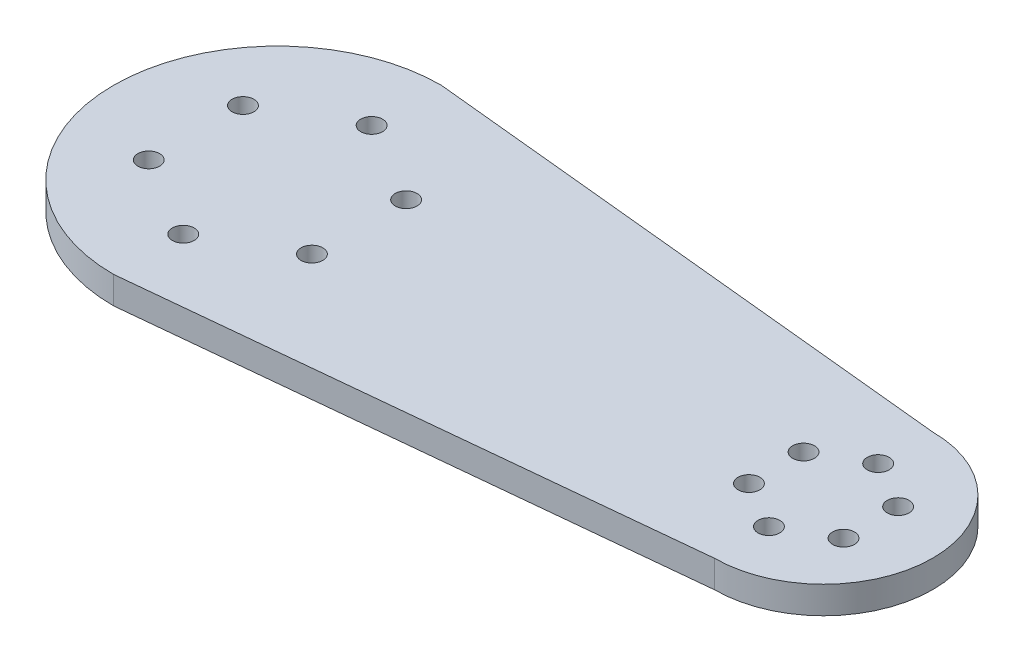
ISO-10303-21;
HEADER;
FILE_DESCRIPTION(('STEP AP214'),'2;1');
FILE_NAME('part.step','',(''),(''),'','','');
FILE_SCHEMA(('AUTOMOTIVE_DESIGN { 1 0 10303 214 1 1 1 1 }'));
ENDSEC;
DATA;
#1=APPLICATION_CONTEXT('core data for automotive mechanical design processes');
#2=APPLICATION_PROTOCOL_DEFINITION('international standard','automotive_design',2000,#1);
#3=PRODUCT_CONTEXT('',#1,'mechanical');
#4=PRODUCT('Part','Part','',(#3));
#5=PRODUCT_RELATED_PRODUCT_CATEGORY('part','',(#4));
#6=PRODUCT_DEFINITION_FORMATION('','',#4);
#7=PRODUCT_DEFINITION_CONTEXT('part definition',#1,'design');
#8=PRODUCT_DEFINITION('design','',#6,#7);
#9=PRODUCT_DEFINITION_SHAPE('','',#8);
#10=(LENGTH_UNIT() NAMED_UNIT(*) SI_UNIT(.MILLI.,.METRE.));
#11=(NAMED_UNIT(*) PLANE_ANGLE_UNIT() SI_UNIT($,.RADIAN.));
#12=(NAMED_UNIT(*) SI_UNIT($,.STERADIAN.) SOLID_ANGLE_UNIT());
#13=UNCERTAINTY_MEASURE_WITH_UNIT(LENGTH_MEASURE(1.E-05),#10,'distance_accuracy_value','');
#14=(GEOMETRIC_REPRESENTATION_CONTEXT(3) GLOBAL_UNCERTAINTY_ASSIGNED_CONTEXT((#13)) GLOBAL_UNIT_ASSIGNED_CONTEXT((#10,
#11,#12)) REPRESENTATION_CONTEXT('',''));
#15=CARTESIAN_POINT('',(0.,0.,0.));
#16=DIRECTION('',(0.,0.,1.));
#17=DIRECTION('',(1.,0.,0.));
#18=AXIS2_PLACEMENT_3D('',#15,#16,#17);
#19=CARTESIAN_POINT('',(2.97029702970297,5.,29.7029702970297));
#20=DIRECTION('',(-0.0995037190209989,0.,-0.995037190209989));
#21=DIRECTION('',(-0.995037190209989,0.,0.0995037190209989));
#22=AXIS2_PLACEMENT_3D('',#19,#20,#21);
#23=PLANE('',#22);
#24=DIRECTION('',(0.995037190209989,0.,-0.0995037190209989));
#25=VECTOR('',#24,1.);
#26=CARTESIAN_POINT('',(2.97029702970297,0.,29.7029702970297));
#27=LINE('',#26,#25);
#28=CARTESIAN_POINT('',(0.,0.,30.));
#29=VERTEX_POINT('',#28);
#30=CARTESIAN_POINT('',(100.,0.,20.));
#31=VERTEX_POINT('',#30);
#32=EDGE_CURVE('E164',#29,#31,#27,.T.);
#33=ORIENTED_EDGE('',*,*,#32,.T.);
#34=DIRECTION('',(0.,-1.,0.));
#35=VECTOR('',#34,1.);
#36=CARTESIAN_POINT('',(100.,5.,20.));
#37=LINE('',#36,#35);
#38=CARTESIAN_POINT('',(100.,5.,20.));
#39=VERTEX_POINT('',#38);
#40=EDGE_CURVE('E11',#39,#31,#37,.T.);
#41=ORIENTED_EDGE('',*,*,#40,.F.);
#42=DIRECTION('',(0.995037190209989,0.,-0.0995037190209989));
#43=VECTOR('',#42,1.);
#44=CARTESIAN_POINT('',(2.97029702970297,5.,29.7029702970297));
#45=LINE('',#44,#43);
#46=CARTESIAN_POINT('',(0.,5.,30.));
#47=VERTEX_POINT('',#46);
#48=EDGE_CURVE('E97',#47,#39,#45,.T.);
#49=ORIENTED_EDGE('',*,*,#48,.F.);
#50=DIRECTION('',(0.,-1.,0.));
#51=VECTOR('',#50,1.);
#52=CARTESIAN_POINT('',(0.,5.,30.));
#53=LINE('',#52,#51);
#54=EDGE_CURVE('E123',#47,#29,#53,.T.);
#55=ORIENTED_EDGE('',*,*,#54,.T.);
#56=EDGE_LOOP('',(#33,#41,#49,#55));
#57=FACE_BOUND('',#56,.T.);
#58=ADVANCED_FACE('F47',(#57),#23,.F.);
#59=CARTESIAN_POINT('',(100.,5.,0.));
#60=DIRECTION('',(0.,-1.,0.));
#61=DIRECTION('',(0.,0.,-1.));
#62=AXIS2_PLACEMENT_3D('',#59,#60,#61);
#63=CYLINDRICAL_SURFACE('',#62,20.);
#64=CARTESIAN_POINT('',(100.,0.,0.));
#65=DIRECTION('',(0.,1.,0.));
#66=DIRECTION('',(0.,0.,1.));
#67=AXIS2_PLACEMENT_3D('',#64,#65,#66);
#68=CIRCLE('',#67,20.);
#69=CARTESIAN_POINT('',(100.,0.,-20.));
#70=VERTEX_POINT('',#69);
#71=EDGE_CURVE('E103',#31,#70,#68,.T.);
#72=ORIENTED_EDGE('',*,*,#71,.T.);
#73=DIRECTION('',(0.,-1.,0.));
#74=VECTOR('',#73,1.);
#75=CARTESIAN_POINT('',(100.,5.,-20.));
#76=LINE('',#75,#74);
#77=CARTESIAN_POINT('',(100.,5.,-20.));
#78=VERTEX_POINT('',#77);
#79=EDGE_CURVE('E57',#78,#70,#76,.T.);
#80=ORIENTED_EDGE('',*,*,#79,.F.);
#81=CARTESIAN_POINT('',(100.,5.,0.));
#82=DIRECTION('',(0.,1.,0.));
#83=DIRECTION('',(0.,0.,1.));
#84=AXIS2_PLACEMENT_3D('',#81,#82,#83);
#85=CIRCLE('',#84,20.);
#86=EDGE_CURVE('E91',#39,#78,#85,.T.);
#87=ORIENTED_EDGE('',*,*,#86,.F.);
#88=ORIENTED_EDGE('',*,*,#40,.T.);
#89=EDGE_LOOP('',(#72,#80,#87,#88));
#90=FACE_BOUND('',#89,.T.);
#91=ADVANCED_FACE('F102',(#90),#63,.T.);
#92=CARTESIAN_POINT('',(2.97029702970297,5.,-29.7029702970297));
#93=DIRECTION('',(0.0995037190209989,0.,-0.995037190209989));
#94=DIRECTION('',(-0.995037190209989,0.,-0.0995037190209989));
#95=AXIS2_PLACEMENT_3D('',#92,#93,#94);
#96=PLANE('',#95);
#97=DIRECTION('',(0.995037190209989,0.,0.0995037190209989));
#98=VECTOR('',#97,1.);
#99=CARTESIAN_POINT('',(2.97029702970297,0.,-29.7029702970297));
#100=LINE('',#99,#98);
#101=CARTESIAN_POINT('',(0.,0.,-30.));
#102=VERTEX_POINT('',#101);
#103=EDGE_CURVE('E170',#102,#70,#100,.T.);
#104=ORIENTED_EDGE('',*,*,#103,.F.);
#105=DIRECTION('',(0.,-1.,0.));
#106=VECTOR('',#105,1.);
#107=CARTESIAN_POINT('',(0.,5.,-30.));
#108=LINE('',#107,#106);
#109=CARTESIAN_POINT('',(0.,5.,-30.));
#110=VERTEX_POINT('',#109);
#111=EDGE_CURVE('E81',#110,#102,#108,.T.);
#112=ORIENTED_EDGE('',*,*,#111,.F.);
#113=DIRECTION('',(0.995037190209989,0.,0.0995037190209989));
#114=VECTOR('',#113,1.);
#115=CARTESIAN_POINT('',(2.97029702970297,5.,-29.7029702970297));
#116=LINE('',#115,#114);
#117=EDGE_CURVE('E95',#110,#78,#116,.T.);
#118=ORIENTED_EDGE('',*,*,#117,.T.);
#119=ORIENTED_EDGE('',*,*,#79,.T.);
#120=EDGE_LOOP('',(#104,#112,#118,#119));
#121=FACE_BOUND('',#120,.T.);
#122=ADVANCED_FACE('F108',(#121),#96,.T.);
#123=CARTESIAN_POINT('',(-14.9389382152816,5.,8.62499999999986));
#124=DIRECTION('',(0.,-1.,0.));
#125=DIRECTION('',(0.,0.,-1.));
#126=AXIS2_PLACEMENT_3D('',#123,#124,#125);
#127=CYLINDRICAL_SURFACE('',#126,2.);
#128=CARTESIAN_POINT('',(-14.9389382152816,5.,8.62499999999986));
#129=DIRECTION('',(0.,1.,0.));
#130=DIRECTION('',(0.,0.,1.));
#131=AXIS2_PLACEMENT_3D('',#128,#129,#130);
#132=CIRCLE('',#131,2.);
#133=CARTESIAN_POINT('',(-14.9389382152816,5.,10.6249999999999));
#134=VERTEX_POINT('',#133);
#135=EDGE_CURVE('E112',#134,#134,#132,.T.);
#136=ORIENTED_EDGE('',*,*,#135,.T.);
#137=EDGE_LOOP('',(#136));
#138=FACE_BOUND('',#137,.T.);
#139=CARTESIAN_POINT('',(-14.9389382152816,0.,8.62499999999986));
#140=DIRECTION('',(0.,1.,0.));
#141=DIRECTION('',(0.,0.,1.));
#142=AXIS2_PLACEMENT_3D('',#139,#140,#141);
#143=CIRCLE('',#142,2.);
#144=CARTESIAN_POINT('',(-14.9389382152816,0.,10.6249999999999));
#145=VERTEX_POINT('',#144);
#146=EDGE_CURVE('E175',#145,#145,#143,.T.);
#147=ORIENTED_EDGE('',*,*,#146,.F.);
#148=EDGE_LOOP('',(#147));
#149=FACE_BOUND('',#148,.T.);
#150=ADVANCED_FACE('F446',(#138,#149),#127,.F.);
#151=CARTESIAN_POINT('',(0.,5.,0.));
#152=DIRECTION('',(0.,-1.,0.));
#153=DIRECTION('',(0.,0.,-1.));
#154=AXIS2_PLACEMENT_3D('',#151,#152,#153);
#155=CYLINDRICAL_SURFACE('',#154,30.);
#156=CARTESIAN_POINT('',(0.,0.,0.));
#157=DIRECTION('',(0.,1.,0.));
#158=DIRECTION('',(0.,0.,1.));
#159=AXIS2_PLACEMENT_3D('',#156,#157,#158);
#160=CIRCLE('',#159,30.);
#161=EDGE_CURVE('E84',#102,#29,#160,.T.);
#162=ORIENTED_EDGE('',*,*,#161,.T.);
#163=ORIENTED_EDGE('',*,*,#54,.F.);
#164=CARTESIAN_POINT('',(0.,5.,0.));
#165=DIRECTION('',(0.,1.,0.));
#166=DIRECTION('',(0.,0.,1.));
#167=AXIS2_PLACEMENT_3D('',#164,#165,#166);
#168=CIRCLE('',#167,30.);
#169=EDGE_CURVE('E65',#110,#47,#168,.T.);
#170=ORIENTED_EDGE('',*,*,#169,.F.);
#171=ORIENTED_EDGE('',*,*,#111,.T.);
#172=EDGE_LOOP('',(#162,#163,#170,#171));
#173=FACE_BOUND('',#172,.T.);
#174=ADVANCED_FACE('F224',(#173),#155,.T.);
#175=CARTESIAN_POINT('',(-1.20456106190088E-13,5.,17.25));
#176=DIRECTION('',(0.,-1.,0.));
#177=DIRECTION('',(0.,0.,-1.));
#178=AXIS2_PLACEMENT_3D('',#175,#176,#177);
#179=CYLINDRICAL_SURFACE('',#178,2.);
#180=CARTESIAN_POINT('',(-1.20456106190088E-13,5.,17.25));
#181=DIRECTION('',(0.,1.,0.));
#182=DIRECTION('',(0.,0.,1.));
#183=AXIS2_PLACEMENT_3D('',#180,#181,#182);
#184=CIRCLE('',#183,2.);
#185=CARTESIAN_POINT('',(-1.20456106190088E-13,5.,19.25));
#186=VERTEX_POINT('',#185);
#187=EDGE_CURVE('E321',#186,#186,#184,.T.);
#188=ORIENTED_EDGE('',*,*,#187,.T.);
#189=EDGE_LOOP('',(#188));
#190=FACE_BOUND('',#189,.T.);
#191=CARTESIAN_POINT('',(-1.20456106190088E-13,0.,17.25));
#192=DIRECTION('',(0.,1.,0.));
#193=DIRECTION('',(0.,0.,1.));
#194=AXIS2_PLACEMENT_3D('',#191,#192,#193);
#195=CIRCLE('',#194,2.);
#196=CARTESIAN_POINT('',(-1.20456106190088E-13,0.,19.25));
#197=VERTEX_POINT('',#196);
#198=EDGE_CURVE('E160',#197,#197,#195,.T.);
#199=ORIENTED_EDGE('',*,*,#198,.F.);
#200=EDGE_LOOP('',(#199));
#201=FACE_BOUND('',#200,.T.);
#202=ADVANCED_FACE('F220',(#190,#201),#179,.F.);
#203=CARTESIAN_POINT('',(14.9389382152815,5.,8.62500000000007));
#204=DIRECTION('',(0.,-1.,0.));
#205=DIRECTION('',(0.,0.,-1.));
#206=AXIS2_PLACEMENT_3D('',#203,#204,#205);
#207=CYLINDRICAL_SURFACE('',#206,2.);
#208=CARTESIAN_POINT('',(14.9389382152815,5.,8.62500000000007));
#209=DIRECTION('',(0.,1.,0.));
#210=DIRECTION('',(0.,0.,1.));
#211=AXIS2_PLACEMENT_3D('',#208,#209,#210);
#212=CIRCLE('',#211,2.);
#213=CARTESIAN_POINT('',(14.9389382152815,5.,10.6250000000001));
#214=VERTEX_POINT('',#213);
#215=EDGE_CURVE('E317',#214,#214,#212,.T.);
#216=ORIENTED_EDGE('',*,*,#215,.T.);
#217=EDGE_LOOP('',(#216));
#218=FACE_BOUND('',#217,.T.);
#219=CARTESIAN_POINT('',(14.9389382152815,0.,8.62500000000007));
#220=DIRECTION('',(0.,1.,0.));
#221=DIRECTION('',(0.,0.,1.));
#222=AXIS2_PLACEMENT_3D('',#219,#220,#221);
#223=CIRCLE('',#222,2.);
#224=CARTESIAN_POINT('',(14.9389382152815,0.,10.6250000000001));
#225=VERTEX_POINT('',#224);
#226=EDGE_CURVE('E156',#225,#225,#223,.T.);
#227=ORIENTED_EDGE('',*,*,#226,.F.);
#228=EDGE_LOOP('',(#227));
#229=FACE_BOUND('',#228,.T.);
#230=ADVANCED_FACE('F223',(#218,#229),#207,.F.);
#231=CARTESIAN_POINT('',(14.9389382152816,5.,-8.62499999999997));
#232=DIRECTION('',(0.,-1.,0.));
#233=DIRECTION('',(0.,0.,-1.));
#234=AXIS2_PLACEMENT_3D('',#231,#232,#233);
#235=CYLINDRICAL_SURFACE('',#234,2.);
#236=CARTESIAN_POINT('',(14.9389382152816,5.,-8.62499999999997));
#237=DIRECTION('',(0.,1.,0.));
#238=DIRECTION('',(0.,0.,1.));
#239=AXIS2_PLACEMENT_3D('',#236,#237,#238);
#240=CIRCLE('',#239,2.);
#241=CARTESIAN_POINT('',(14.9389382152816,5.,-6.62499999999996));
#242=VERTEX_POINT('',#241);
#243=EDGE_CURVE('E313',#242,#242,#240,.T.);
#244=ORIENTED_EDGE('',*,*,#243,.T.);
#245=EDGE_LOOP('',(#244));
#246=FACE_BOUND('',#245,.T.);
#247=CARTESIAN_POINT('',(14.9389382152816,0.,-8.62499999999997));
#248=DIRECTION('',(0.,1.,0.));
#249=DIRECTION('',(0.,0.,1.));
#250=AXIS2_PLACEMENT_3D('',#247,#248,#249);
#251=CIRCLE('',#250,2.);
#252=CARTESIAN_POINT('',(14.9389382152816,0.,-6.62499999999996));
#253=VERTEX_POINT('',#252);
#254=EDGE_CURVE('E152',#253,#253,#251,.T.);
#255=ORIENTED_EDGE('',*,*,#254,.F.);
#256=EDGE_LOOP('',(#255));
#257=FACE_BOUND('',#256,.T.);
#258=ADVANCED_FACE('F228',(#246,#257),#235,.F.);
#259=CARTESIAN_POINT('',(0.,5.,-17.25));
#260=DIRECTION('',(0.,-1.,0.));
#261=DIRECTION('',(0.,0.,-1.));
#262=AXIS2_PLACEMENT_3D('',#259,#260,#261);
#263=CYLINDRICAL_SURFACE('',#262,2.);
#264=CARTESIAN_POINT('',(0.,5.,-17.25));
#265=DIRECTION('',(0.,1.,0.));
#266=DIRECTION('',(0.,0.,1.));
#267=AXIS2_PLACEMENT_3D('',#264,#265,#266);
#268=CIRCLE('',#267,2.);
#269=CARTESIAN_POINT('',(0.,5.,-15.25));
#270=VERTEX_POINT('',#269);
#271=EDGE_CURVE('E309',#270,#270,#268,.T.);
#272=ORIENTED_EDGE('',*,*,#271,.T.);
#273=EDGE_LOOP('',(#272));
#274=FACE_BOUND('',#273,.T.);
#275=CARTESIAN_POINT('',(0.,0.,-17.25));
#276=DIRECTION('',(0.,1.,0.));
#277=DIRECTION('',(0.,0.,1.));
#278=AXIS2_PLACEMENT_3D('',#275,#276,#277);
#279=CIRCLE('',#278,2.);
#280=CARTESIAN_POINT('',(0.,0.,-15.25));
#281=VERTEX_POINT('',#280);
#282=EDGE_CURVE('E148',#281,#281,#279,.T.);
#283=ORIENTED_EDGE('',*,*,#282,.F.);
#284=EDGE_LOOP('',(#283));
#285=FACE_BOUND('',#284,.T.);
#286=ADVANCED_FACE('F232',(#274,#285),#263,.F.);
#287=CARTESIAN_POINT('',(-14.9389382152815,5.,-8.62500000000018));
#288=DIRECTION('',(0.,-1.,0.));
#289=DIRECTION('',(0.,0.,-1.));
#290=AXIS2_PLACEMENT_3D('',#287,#288,#289);
#291=CYLINDRICAL_SURFACE('',#290,2.);
#292=CARTESIAN_POINT('',(-14.9389382152815,5.,-8.62500000000018));
#293=DIRECTION('',(0.,1.,0.));
#294=DIRECTION('',(0.,0.,1.));
#295=AXIS2_PLACEMENT_3D('',#292,#293,#294);
#296=CIRCLE('',#295,2.);
#297=CARTESIAN_POINT('',(-14.9389382152815,5.,-6.62500000000017));
#298=VERTEX_POINT('',#297);
#299=EDGE_CURVE('E305',#298,#298,#296,.T.);
#300=ORIENTED_EDGE('',*,*,#299,.T.);
#301=EDGE_LOOP('',(#300));
#302=FACE_BOUND('',#301,.T.);
#303=CARTESIAN_POINT('',(-14.9389382152815,0.,-8.62500000000018));
#304=DIRECTION('',(0.,1.,0.));
#305=DIRECTION('',(0.,0.,1.));
#306=AXIS2_PLACEMENT_3D('',#303,#304,#305);
#307=CIRCLE('',#306,2.);
#308=CARTESIAN_POINT('',(-14.9389382152815,0.,-6.62500000000017));
#309=VERTEX_POINT('',#308);
#310=EDGE_CURVE('E144',#309,#309,#307,.T.);
#311=ORIENTED_EDGE('',*,*,#310,.F.);
#312=EDGE_LOOP('',(#311));
#313=FACE_BOUND('',#312,.T.);
#314=ADVANCED_FACE('F236',(#302,#313),#291,.F.);
#315=CARTESIAN_POINT('',(100.000000000001,5.,10.));
#316=DIRECTION('',(0.,-1.,0.));
#317=DIRECTION('',(0.,0.,-1.));
#318=AXIS2_PLACEMENT_3D('',#315,#316,#317);
#319=CYLINDRICAL_SURFACE('',#318,1.99999999999999);
#320=CARTESIAN_POINT('',(100.000000000001,5.,10.));
#321=DIRECTION('',(0.,1.,0.));
#322=DIRECTION('',(0.,0.,1.));
#323=AXIS2_PLACEMENT_3D('',#320,#321,#322);
#324=CIRCLE('',#323,1.99999999999999);
#325=CARTESIAN_POINT('',(100.000000000001,5.,12.));
#326=VERTEX_POINT('',#325);
#327=EDGE_CURVE('E301',#326,#326,#324,.T.);
#328=ORIENTED_EDGE('',*,*,#327,.T.);
#329=EDGE_LOOP('',(#328));
#330=FACE_BOUND('',#329,.T.);
#331=CARTESIAN_POINT('',(100.000000000001,0.,10.));
#332=DIRECTION('',(0.,1.,0.));
#333=DIRECTION('',(0.,0.,1.));
#334=AXIS2_PLACEMENT_3D('',#331,#332,#333);
#335=CIRCLE('',#334,1.99999999999999);
#336=CARTESIAN_POINT('',(100.000000000001,0.,12.));
#337=VERTEX_POINT('',#336);
#338=EDGE_CURVE('E140',#337,#337,#335,.T.);
#339=ORIENTED_EDGE('',*,*,#338,.F.);
#340=EDGE_LOOP('',(#339));
#341=FACE_BOUND('',#340,.T.);
#342=ADVANCED_FACE('F240',(#330,#341),#319,.F.);
#343=CARTESIAN_POINT('',(108.660254037845,5.,4.99999999999966));
#344=DIRECTION('',(0.,-1.,0.));
#345=DIRECTION('',(0.,0.,-1.));
#346=AXIS2_PLACEMENT_3D('',#343,#344,#345);
#347=CYLINDRICAL_SURFACE('',#346,2.);
#348=CARTESIAN_POINT('',(108.660254037845,5.,4.99999999999966));
#349=DIRECTION('',(0.,1.,0.));
#350=DIRECTION('',(0.,0.,1.));
#351=AXIS2_PLACEMENT_3D('',#348,#349,#350);
#352=CIRCLE('',#351,2.);
#353=CARTESIAN_POINT('',(108.660254037845,5.,6.99999999999966));
#354=VERTEX_POINT('',#353);
#355=EDGE_CURVE('E293',#354,#354,#352,.T.);
#356=ORIENTED_EDGE('',*,*,#355,.T.);
#357=EDGE_LOOP('',(#356));
#358=FACE_BOUND('',#357,.T.);
#359=CARTESIAN_POINT('',(108.660254037845,0.,4.99999999999966));
#360=DIRECTION('',(0.,1.,0.));
#361=DIRECTION('',(0.,0.,1.));
#362=AXIS2_PLACEMENT_3D('',#359,#360,#361);
#363=CIRCLE('',#362,2.);
#364=CARTESIAN_POINT('',(108.660254037845,0.,6.99999999999966));
#365=VERTEX_POINT('',#364);
#366=EDGE_CURVE('E136',#365,#365,#363,.T.);
#367=ORIENTED_EDGE('',*,*,#366,.F.);
#368=EDGE_LOOP('',(#367));
#369=FACE_BOUND('',#368,.T.);
#370=ADVANCED_FACE('F244',(#358,#369),#347,.F.);
#371=CARTESIAN_POINT('',(108.660254037845,5.,-5.00000000000034));
#372=DIRECTION('',(0.,-1.,0.));
#373=DIRECTION('',(0.,0.,-1.));
#374=AXIS2_PLACEMENT_3D('',#371,#372,#373);
#375=CYLINDRICAL_SURFACE('',#374,2.);
#376=CARTESIAN_POINT('',(108.660254037845,5.,-5.00000000000034));
#377=DIRECTION('',(0.,1.,0.));
#378=DIRECTION('',(0.,0.,1.));
#379=AXIS2_PLACEMENT_3D('',#376,#377,#378);
#380=CIRCLE('',#379,2.);
#381=CARTESIAN_POINT('',(108.660254037845,5.,-3.00000000000034));
#382=VERTEX_POINT('',#381);
#383=EDGE_CURVE('E288',#382,#382,#380,.T.);
#384=ORIENTED_EDGE('',*,*,#383,.T.);
#385=EDGE_LOOP('',(#384));
#386=FACE_BOUND('',#385,.T.);
#387=CARTESIAN_POINT('',(108.660254037845,0.,-5.00000000000034));
#388=DIRECTION('',(0.,1.,0.));
#389=DIRECTION('',(0.,0.,1.));
#390=AXIS2_PLACEMENT_3D('',#387,#388,#389);
#391=CIRCLE('',#390,2.);
#392=CARTESIAN_POINT('',(108.660254037845,0.,-3.00000000000034));
#393=VERTEX_POINT('',#392);
#394=EDGE_CURVE('E132',#393,#393,#391,.T.);
#395=ORIENTED_EDGE('',*,*,#394,.F.);
#396=EDGE_LOOP('',(#395));
#397=FACE_BOUND('',#396,.T.);
#398=ADVANCED_FACE('F248',(#386,#397),#375,.F.);
#399=CARTESIAN_POINT('',(100.,5.,-9.99999999999999));
#400=DIRECTION('',(0.,-1.,0.));
#401=DIRECTION('',(0.,0.,-1.));
#402=AXIS2_PLACEMENT_3D('',#399,#400,#401);
#403=CYLINDRICAL_SURFACE('',#402,2.);
#404=CARTESIAN_POINT('',(100.,5.,-9.99999999999999));
#405=DIRECTION('',(0.,1.,0.));
#406=DIRECTION('',(0.,0.,1.));
#407=AXIS2_PLACEMENT_3D('',#404,#405,#406);
#408=CIRCLE('',#407,2.);
#409=CARTESIAN_POINT('',(100.,5.,-8.));
#410=VERTEX_POINT('',#409);
#411=EDGE_CURVE('E259',#410,#410,#408,.T.);
#412=ORIENTED_EDGE('',*,*,#411,.T.);
#413=EDGE_LOOP('',(#412));
#414=FACE_BOUND('',#413,.T.);
#415=CARTESIAN_POINT('',(100.,0.,-9.99999999999999));
#416=DIRECTION('',(0.,1.,0.));
#417=DIRECTION('',(0.,0.,1.));
#418=AXIS2_PLACEMENT_3D('',#415,#416,#417);
#419=CIRCLE('',#418,2.);
#420=CARTESIAN_POINT('',(100.,0.,-8.));
#421=VERTEX_POINT('',#420);
#422=EDGE_CURVE('E128',#421,#421,#419,.T.);
#423=ORIENTED_EDGE('',*,*,#422,.F.);
#424=EDGE_LOOP('',(#423));
#425=FACE_BOUND('',#424,.T.);
#426=ADVANCED_FACE('F209',(#414,#425),#403,.F.);
#427=CARTESIAN_POINT('',(91.3397459621559,5.,-4.99999999999974));
#428=DIRECTION('',(0.,-1.,0.));
#429=DIRECTION('',(0.,0.,-1.));
#430=AXIS2_PLACEMENT_3D('',#427,#428,#429);
#431=CYLINDRICAL_SURFACE('',#430,1.99999999999999);
#432=CARTESIAN_POINT('',(91.3397459621559,5.,-4.99999999999974));
#433=DIRECTION('',(0.,1.,0.));
#434=DIRECTION('',(0.,0.,1.));
#435=AXIS2_PLACEMENT_3D('',#432,#433,#434);
#436=CIRCLE('',#435,1.99999999999999);
#437=CARTESIAN_POINT('',(91.3397459621559,5.,-2.99999999999975));
#438=VERTEX_POINT('',#437);
#439=EDGE_CURVE('E183',#438,#438,#436,.T.);
#440=ORIENTED_EDGE('',*,*,#439,.T.);
#441=EDGE_LOOP('',(#440));
#442=FACE_BOUND('',#441,.T.);
#443=CARTESIAN_POINT('',(91.3397459621559,0.,-4.99999999999974));
#444=DIRECTION('',(0.,1.,0.));
#445=DIRECTION('',(0.,0.,1.));
#446=AXIS2_PLACEMENT_3D('',#443,#444,#445);
#447=CIRCLE('',#446,1.99999999999999);
#448=CARTESIAN_POINT('',(91.3397459621559,0.,-2.99999999999975));
#449=VERTEX_POINT('',#448);
#450=EDGE_CURVE('E124',#449,#449,#447,.T.);
#451=ORIENTED_EDGE('',*,*,#450,.F.);
#452=EDGE_LOOP('',(#451));
#453=FACE_BOUND('',#452,.T.);
#454=ADVANCED_FACE('F49',(#442,#453),#431,.F.);
#455=CARTESIAN_POINT('',(91.3397459621562,5.,5.00000000000028));
#456=DIRECTION('',(0.,-1.,0.));
#457=DIRECTION('',(0.,0.,-1.));
#458=AXIS2_PLACEMENT_3D('',#455,#456,#457);
#459=CYLINDRICAL_SURFACE('',#458,2.);
#460=CARTESIAN_POINT('',(91.3397459621562,5.,5.00000000000028));
#461=DIRECTION('',(0.,1.,0.));
#462=DIRECTION('',(0.,0.,1.));
#463=AXIS2_PLACEMENT_3D('',#460,#461,#462);
#464=CIRCLE('',#463,2.);
#465=CARTESIAN_POINT('',(91.3397459621562,5.,7.00000000000028));
#466=VERTEX_POINT('',#465);
#467=EDGE_CURVE('E119',#466,#466,#464,.T.);
#468=ORIENTED_EDGE('',*,*,#467,.T.);
#469=EDGE_LOOP('',(#468));
#470=FACE_BOUND('',#469,.T.);
#471=CARTESIAN_POINT('',(91.3397459621562,0.,5.00000000000028));
#472=DIRECTION('',(0.,1.,0.));
#473=DIRECTION('',(0.,0.,1.));
#474=AXIS2_PLACEMENT_3D('',#471,#472,#473);
#475=CIRCLE('',#474,2.);
#476=CARTESIAN_POINT('',(91.3397459621562,0.,7.00000000000028));
#477=VERTEX_POINT('',#476);
#478=EDGE_CURVE('E179',#477,#477,#475,.T.);
#479=ORIENTED_EDGE('',*,*,#478,.F.);
#480=EDGE_LOOP('',(#479));
#481=FACE_BOUND('',#480,.T.);
#482=ADVANCED_FACE('F199',(#470,#481),#459,.F.);
#483=CARTESIAN_POINT('',(0.,5.,0.));
#484=DIRECTION('',(0.,1.,0.));
#485=DIRECTION('',(0.,0.,1.));
#486=AXIS2_PLACEMENT_3D('',#483,#484,#485);
#487=PLANE('',#486);
#488=ORIENTED_EDGE('',*,*,#439,.F.);
#489=EDGE_LOOP('',(#488));
#490=FACE_BOUND('',#489,.T.);
#491=ORIENTED_EDGE('',*,*,#411,.F.);
#492=EDGE_LOOP('',(#491));
#493=FACE_BOUND('',#492,.T.);
#494=ORIENTED_EDGE('',*,*,#383,.F.);
#495=EDGE_LOOP('',(#494));
#496=FACE_BOUND('',#495,.T.);
#497=ORIENTED_EDGE('',*,*,#355,.F.);
#498=EDGE_LOOP('',(#497));
#499=FACE_BOUND('',#498,.T.);
#500=ORIENTED_EDGE('',*,*,#327,.F.);
#501=EDGE_LOOP('',(#500));
#502=FACE_BOUND('',#501,.T.);
#503=ORIENTED_EDGE('',*,*,#299,.F.);
#504=EDGE_LOOP('',(#503));
#505=FACE_BOUND('',#504,.T.);
#506=ORIENTED_EDGE('',*,*,#271,.F.);
#507=EDGE_LOOP('',(#506));
#508=FACE_BOUND('',#507,.T.);
#509=ORIENTED_EDGE('',*,*,#243,.F.);
#510=EDGE_LOOP('',(#509));
#511=FACE_BOUND('',#510,.T.);
#512=ORIENTED_EDGE('',*,*,#215,.F.);
#513=EDGE_LOOP('',(#512));
#514=FACE_BOUND('',#513,.T.);
#515=ORIENTED_EDGE('',*,*,#187,.F.);
#516=EDGE_LOOP('',(#515));
#517=FACE_BOUND('',#516,.T.);
#518=ORIENTED_EDGE('',*,*,#48,.T.);
#519=ORIENTED_EDGE('',*,*,#86,.T.);
#520=ORIENTED_EDGE('',*,*,#117,.F.);
#521=ORIENTED_EDGE('',*,*,#169,.T.);
#522=EDGE_LOOP('',(#518,#519,#520,#521));
#523=FACE_BOUND('',#522,.T.);
#524=ORIENTED_EDGE('',*,*,#135,.F.);
#525=EDGE_LOOP('',(#524));
#526=FACE_BOUND('',#525,.T.);
#527=ORIENTED_EDGE('',*,*,#467,.F.);
#528=EDGE_LOOP('',(#527));
#529=FACE_BOUND('',#528,.T.);
#530=ADVANCED_FACE('F92',(#490,#493,#496,#499,#502,#505,#508,#511,#514,#517,#523,#526,#529),
#487,.T.);
#531=CARTESIAN_POINT('',(0.,0.,0.));
#532=DIRECTION('',(0.,1.,0.));
#533=DIRECTION('',(0.,0.,1.));
#534=AXIS2_PLACEMENT_3D('',#531,#532,#533);
#535=PLANE('',#534);
#536=ORIENTED_EDGE('',*,*,#450,.T.);
#537=EDGE_LOOP('',(#536));
#538=FACE_BOUND('',#537,.T.);
#539=ORIENTED_EDGE('',*,*,#422,.T.);
#540=EDGE_LOOP('',(#539));
#541=FACE_BOUND('',#540,.T.);
#542=ORIENTED_EDGE('',*,*,#394,.T.);
#543=EDGE_LOOP('',(#542));
#544=FACE_BOUND('',#543,.T.);
#545=ORIENTED_EDGE('',*,*,#366,.T.);
#546=EDGE_LOOP('',(#545));
#547=FACE_BOUND('',#546,.T.);
#548=ORIENTED_EDGE('',*,*,#338,.T.);
#549=EDGE_LOOP('',(#548));
#550=FACE_BOUND('',#549,.T.);
#551=ORIENTED_EDGE('',*,*,#310,.T.);
#552=EDGE_LOOP('',(#551));
#553=FACE_BOUND('',#552,.T.);
#554=ORIENTED_EDGE('',*,*,#282,.T.);
#555=EDGE_LOOP('',(#554));
#556=FACE_BOUND('',#555,.T.);
#557=ORIENTED_EDGE('',*,*,#254,.T.);
#558=EDGE_LOOP('',(#557));
#559=FACE_BOUND('',#558,.T.);
#560=ORIENTED_EDGE('',*,*,#226,.T.);
#561=EDGE_LOOP('',(#560));
#562=FACE_BOUND('',#561,.T.);
#563=ORIENTED_EDGE('',*,*,#198,.T.);
#564=EDGE_LOOP('',(#563));
#565=FACE_BOUND('',#564,.T.);
#566=ORIENTED_EDGE('',*,*,#32,.F.);
#567=ORIENTED_EDGE('',*,*,#161,.F.);
#568=ORIENTED_EDGE('',*,*,#103,.T.);
#569=ORIENTED_EDGE('',*,*,#71,.F.);
#570=EDGE_LOOP('',(#566,#567,#568,#569));
#571=FACE_BOUND('',#570,.T.);
#572=ORIENTED_EDGE('',*,*,#146,.T.);
#573=EDGE_LOOP('',(#572));
#574=FACE_BOUND('',#573,.T.);
#575=ORIENTED_EDGE('',*,*,#478,.T.);
#576=EDGE_LOOP('',(#575));
#577=FACE_BOUND('',#576,.T.);
#578=ADVANCED_FACE('F190',(#538,#541,#544,#547,#550,#553,#556,#559,#562,#565,#571,#574,#577),
#535,.F.);
#579=CLOSED_SHELL('',(#58,#91,#122,#150,#174,#202,#230,#258,#286,#314,#342,#370,#398,#426,#454,
#482,#530,#578));
#580=MANIFOLD_SOLID_BREP('B2',#579);
#581=ADVANCED_BREP_SHAPE_REPRESENTATION('',(#18,#580),#14);
#582=SHAPE_DEFINITION_REPRESENTATION(#9,#581);
ENDSEC;
END-ISO-10303-21;
